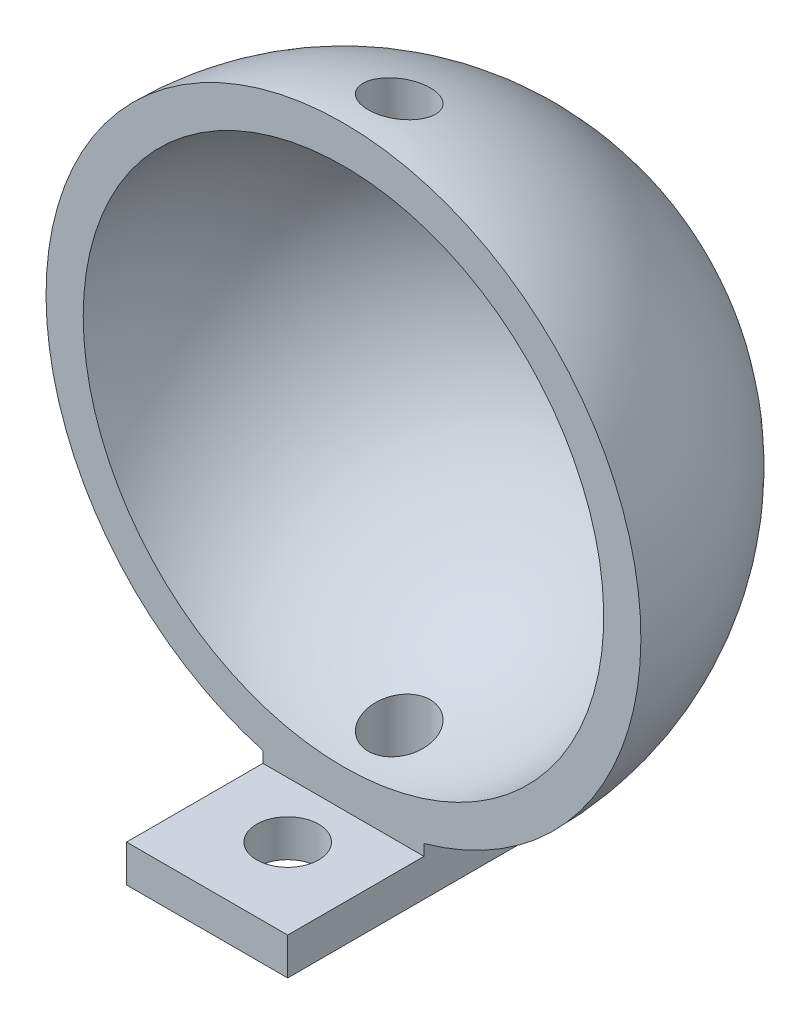
ISO-10303-21;
HEADER;
FILE_DESCRIPTION(('STEP AP214'),'2;1');
FILE_NAME('part.step','',(''),(''),'','','');
FILE_SCHEMA(('AUTOMOTIVE_DESIGN { 1 0 10303 214 1 1 1 1 }'));
ENDSEC;
DATA;
#1=APPLICATION_CONTEXT('core data for automotive mechanical design processes');
#2=APPLICATION_PROTOCOL_DEFINITION('international standard','automotive_design',2000,#1);
#3=PRODUCT_CONTEXT('',#1,'mechanical');
#4=PRODUCT('Part','Part','',(#3));
#5=PRODUCT_RELATED_PRODUCT_CATEGORY('part','',(#4));
#6=PRODUCT_DEFINITION_FORMATION('','',#4);
#7=PRODUCT_DEFINITION_CONTEXT('part definition',#1,'design');
#8=PRODUCT_DEFINITION('design','',#6,#7);
#9=PRODUCT_DEFINITION_SHAPE('','',#8);
#10=(LENGTH_UNIT() NAMED_UNIT(*) SI_UNIT(.MILLI.,.METRE.));
#11=(NAMED_UNIT(*) PLANE_ANGLE_UNIT() SI_UNIT($,.RADIAN.));
#12=(NAMED_UNIT(*) SI_UNIT($,.STERADIAN.) SOLID_ANGLE_UNIT());
#13=UNCERTAINTY_MEASURE_WITH_UNIT(LENGTH_MEASURE(1.E-05),#10,'distance_accuracy_value','');
#14=(GEOMETRIC_REPRESENTATION_CONTEXT(3) GLOBAL_UNCERTAINTY_ASSIGNED_CONTEXT((#13)) GLOBAL_UNIT_ASSIGNED_CONTEXT((#10,
#11,#12)) REPRESENTATION_CONTEXT('',''));
#15=CARTESIAN_POINT('',(0.,0.,0.));
#16=DIRECTION('',(0.,0.,1.));
#17=DIRECTION('',(1.,0.,0.));
#18=AXIS2_PLACEMENT_3D('',#15,#16,#17);
#19=CARTESIAN_POINT('',(-1.99999999999943,73.7499999999998,-8.45125390389471));
#20=DIRECTION('',(0.,0.,-1.));
#21=DIRECTION('',(0.,-1.,0.));
#22=AXIS2_PLACEMENT_3D('',#19,#20,#21);
#23=SPHERICAL_SURFACE('',#22,10.5);
#24=CARTESIAN_POINT('',(-2.98267470453717,83.7574210321402,-11.4738148562225));
#25=CARTESIAN_POINT('',(-3.02698657179367,83.7700945774445,-11.4174460274732));
#26=CARTESIAN_POINT('',(-3.06638557583696,83.7835883483438,-11.3573213167849));
#27=CARTESIAN_POINT('',(-3.1342801377072,83.8117892300735,-11.2313864950616));
#28=CARTESIAN_POINT('',(-3.1627593403856,83.8264981211162,-11.1655680354995));
#29=CARTESIAN_POINT('',(-3.20802566503183,83.8566630799685,-11.030273542497));
#30=CARTESIAN_POINT('',(-3.22482638154331,83.8721182565524,-10.9608018633688));
#31=CARTESIAN_POINT('',(-3.24636999295912,83.9033441842213,-10.8201084791735));
#32=CARTESIAN_POINT('',(-3.25111627564561,83.9191148453863,-10.7488872714771));
#33=CARTESIAN_POINT('',(-3.24842875620823,83.9506982554588,-10.6059221209248));
#34=CARTESIAN_POINT('',(-3.24087094661595,83.9665098092999,-10.5341802014763));
#35=CARTESIAN_POINT('',(-3.21351328844959,83.9975692681323,-10.3929351088143));
#36=CARTESIAN_POINT('',(-3.19371257669824,84.0128171333008,-10.3234320938166));
#37=CARTESIAN_POINT('',(-3.14239297532884,84.0422937299509,-10.1887887583457));
#38=CARTESIAN_POINT('',(-3.11089240210195,84.0565240131714,-10.1236418054889));
#39=CARTESIAN_POINT('',(-3.03697308394031,84.0835808781611,-9.99954045575665));
#40=CARTESIAN_POINT('',(-2.99455514593942,84.0964075635744,-9.94058560165868));
#41=CARTESIAN_POINT('',(-2.90068014223868,84.1200899607425,-9.83155891166125));
#42=CARTESIAN_POINT('',(-2.84937437549965,84.1309732929906,-9.78136287121975));
#43=CARTESIAN_POINT('',(-2.73869438226097,84.1506848258217,-9.69033225246326));
#44=CARTESIAN_POINT('',(-2.67932120326099,84.1595132928121,-9.64949646062903));
#45=CARTESIAN_POINT('',(-2.55562442451351,84.1746695849806,-9.57932510643226));
#46=CARTESIAN_POINT('',(-2.49144207583123,84.1810491524453,-9.54975170432153));
#47=CARTESIAN_POINT('',(-2.35884162587121,84.1913883913049,-9.50179510272381));
#48=CARTESIAN_POINT('',(-2.29042403947887,84.1953483562214,-9.48341054592096));
#49=CARTESIAN_POINT('',(-2.15272368626034,84.2006727567393,-9.45868633378811));
#50=CARTESIAN_POINT('',(-2.0834834449059,84.2020860492207,-9.45211995449979));
#51=CARTESIAN_POINT('',(-1.94486808160945,84.2024243039995,-9.45054862024959));
#52=CARTESIAN_POINT('',(-1.87549296878516,84.201349429034,-9.4555429091693));
#53=CARTESIAN_POINT('',(-1.73917096870216,84.1967634767917,-9.47684011834349));
#54=CARTESIAN_POINT('',(-1.67220885323761,84.1932724135717,-9.49305013482913));
#55=CARTESIAN_POINT('',(-1.54199380448686,84.1839793800973,-9.5361640676761));
#56=CARTESIAN_POINT('',(-1.47874091633887,84.1781773817274,-9.56306811414388));
#57=CARTESIAN_POINT('',(-1.35729953381102,84.1643892934392,-9.62693018146829));
#58=CARTESIAN_POINT('',(-1.29914422775733,84.156390117502,-9.66394843360688));
#59=CARTESIAN_POINT('',(-1.18987537094369,84.1384519512581,-9.74684196775394));
#60=CARTESIAN_POINT('',(-1.13876236560717,84.1285128108459,-9.79271793512896));
#61=CARTESIAN_POINT('',(-1.04404450132552,84.1067776448228,-9.89287095555435));
#62=CARTESIAN_POINT('',(-1.00058858847941,84.094951859924,-9.94728236349669));
#63=CARTESIAN_POINT('',(-0.923400586642896,84.0699006180318,-10.0623223409357));
#64=CARTESIAN_POINT('',(-0.889669594136821,84.0566750034373,-10.1229516104521));
#65=CARTESIAN_POINT('',(-0.832102201822862,84.0288699803854,-10.2501492863576));
#66=CARTESIAN_POINT('',(-0.808503081280336,84.0142669689596,-10.3168199442235));
#67=CARTESIAN_POINT('',(-0.772871347105705,83.9843642230932,-10.453034447679));
#68=CARTESIAN_POINT('',(-0.760839972849812,83.969064414181,-10.5225786003044));
#69=CARTESIAN_POINT('',(-0.748511499916005,83.9379030795133,-10.6638934054602));
#70=CARTESIAN_POINT('',(-0.748428082320024,83.9220364014929,-10.7356816343785));
#71=CARTESIAN_POINT('',(-0.760528240189796,83.8904512986131,-10.8782532220807));
#72=CARTESIAN_POINT('',(-0.772712517693984,83.8747328822901,-10.9490365231208));
#73=CARTESIAN_POINT('',(-0.80915121517212,83.8438058689032,-11.0879924818506));
#74=CARTESIAN_POINT('',(-0.833473030827275,83.828600630392,-11.1561482473993));
#75=CARTESIAN_POINT('',(-0.89360891765945,83.799248172902,-11.2874376223778));
#76=CARTESIAN_POINT('',(-0.929422627811282,83.785100920703,-11.350571389499));
#77=CARTESIAN_POINT('',(-1.01120000487411,83.7584412359706,-11.4693161766889));
#78=CARTESIAN_POINT('',(-1.05705905093194,83.7459139272386,-11.5249958456445));
#79=CARTESIAN_POINT('',(-1.15790195092541,83.7227384988544,-11.6278364393555));
#80=CARTESIAN_POINT('',(-1.21288475379046,83.7120901630329,-11.6749983440649));
#81=CARTESIAN_POINT('',(-1.32914194621312,83.6932465204074,-11.7583507467388));
#82=CARTESIAN_POINT('',(-1.39025298463614,83.6850027833201,-11.7947580743389));
#83=CARTESIAN_POINT('',(-1.51799051046677,83.6709501397213,-11.8567645699069));
#84=CARTESIAN_POINT('',(-1.58461620189052,83.6651408825489,-11.882365294455));
#85=CARTESIAN_POINT('',(-1.71979500116962,83.6562731676182,-11.9214252973123));
#86=CARTESIAN_POINT('',(-1.78826535307279,83.6531529479053,-11.9351572022114));
#87=CARTESIAN_POINT('',(-1.9265996857432,83.6495444077477,-11.951036989628));
#88=CARTESIAN_POINT('',(-1.99646346816201,83.6490557153631,-11.9531865091985));
#89=CARTESIAN_POINT('',(-2.1345483474461,83.6507148617552,-11.9458863092498));
#90=CARTESIAN_POINT('',(-2.20277867591026,83.6528253052409,-11.936601107855));
#91=CARTESIAN_POINT('',(-2.33669383435235,83.6595470825424,-11.9070067410159));
#92=CARTESIAN_POINT('',(-2.40237803609639,83.664159029426,-11.8866948731589));
#93=CARTESIAN_POINT('',(-2.52951196825556,83.6757398745254,-11.8356364324424));
#94=CARTESIAN_POINT('',(-2.59095081137947,83.6827145803086,-11.8048641476448));
#95=CARTESIAN_POINT('',(-2.70771888676437,83.6987837411616,-11.7338686087751));
#96=CARTESIAN_POINT('',(-2.76305506879261,83.7078757475179,-11.6936562719393));
#97=CARTESIAN_POINT('',(-2.84547708695338,83.7238599945206,-11.6228433673364));
#98=CARTESIAN_POINT('',(-2.87498072893177,83.7301684058679,-11.5948721435998));
#99=CARTESIAN_POINT('',(-2.93106985981217,83.7433710651268,-11.5362713316723));
#100=CARTESIAN_POINT('',(-2.957655379521,83.7502653068524,-11.5056417715519));
#101=CARTESIAN_POINT('',(-2.98267470453717,83.7574210321402,-11.4738148562225));
#102=B_SPLINE_CURVE_WITH_KNOTS('',3,(#24,#25,#26,#27,#28,#29,#30,#31,#32,#33,#34,#35,#36,#37,
#38,#39,#40,#41,#42,#43,#44,#45,#46,#47,#48,#49,#50,#51,#52,#53,#54,#55,#56,#57,#58,#59,#60,#61,
#62,#63,#64,#65,#66,#67,#68,#69,#70,#71,#72,#73,#74,#75,#76,#77,#78,#79,#80,#81,#82,#83,#84,#85,
#86,#87,#88,#89,#90,#91,#92,#93,#94,#95,#96,#97,#98,#99,#100,#101),.UNSPECIFIED.,.T.,.F.,(4,2,2,
2,2,2,2,2,2,2,2,2,2,2,2,2,2,2,2,2,2,2,2,2,2,2,2,2,2,2,2,2,2,2,2,2,2,2,4),(0.,0.218283120509509,
0.436891909573116,0.655245795211382,0.873538307805994,1.09404454470742,1.31456633002018,
1.53474432885956,1.75490605838027,1.97163399282794,2.18833381344285,2.40016332138132,
2.61196712721343,2.81966246104674,3.02734421107779,3.23332593952154,3.43931017407156,
3.64654886103659,3.85380358954504,4.06472758787278,4.27567535857958,4.49132459524758,
4.7069969341478,4.92652595316081,5.14606753578644,5.36684195441271,5.58760943794889,
5.80617859543711,6.02472259088614,6.23850070454982,6.45224801515511,6.66094410395764,
6.86961069490486,7.07530983722569,7.28105941501707,7.48731843138981,7.69334007821544,
7.81658819067719,7.93983500187466),.UNSPECIFIED.);
#103=CARTESIAN_POINT('',(-2.98267470453717,83.7574210321402,-11.4738148562225));
#104=VERTEX_POINT('',#103);
#105=EDGE_CURVE('E225',#104,#104,#102,.T.);
#106=ORIENTED_EDGE('',*,*,#105,.T.);
#107=EDGE_LOOP('',(#106));
#108=FACE_BOUND('',#107,.T.);
#109=CARTESIAN_POINT('',(-1.99999999999943,73.7499999999998,-8.45125390389471));
#110=DIRECTION('',(0.,0.,-1.));
#111=DIRECTION('',(-1.,0.,0.));
#112=AXIS2_PLACEMENT_3D('',#109,#110,#111);
#113=CIRCLE('',#112,10.5);
#114=CARTESIAN_POINT('',(-12.4999999999994,73.7499999999998,-8.45125390389471));
#115=VERTEX_POINT('',#114);
#116=EDGE_CURVE('E159',#115,#115,#113,.T.);
#117=ORIENTED_EDGE('',*,*,#116,.F.);
#118=EDGE_LOOP('',(#117));
#119=FACE_BOUND('',#118,.T.);
#120=CARTESIAN_POINT('',(-3.05430325494646,63.7198882633143,-11.3727780260289));
#121=CARTESIAN_POINT('',(-3.01684484619078,63.7330797565567,-11.4315833378468));
#122=CARTESIAN_POINT('',(-2.97436616882103,63.745624750699,-11.4873899455408));
#123=CARTESIAN_POINT('',(-2.8804295307973,63.769031422925,-11.5913436597279));
#124=CARTESIAN_POINT('',(-2.82896297693108,63.7798914711135,-11.6394833509767));
#125=CARTESIAN_POINT('',(-2.71839078021957,63.7995747617412,-11.7266171715136));
#126=CARTESIAN_POINT('',(-2.6592808318253,63.8083968483256,-11.7656061110399));
#127=CARTESIAN_POINT('',(-2.53510330748006,63.8236921296812,-11.8331363218189));
#128=CARTESIAN_POINT('',(-2.47003737293377,63.8301659691776,-11.8616804607723));
#129=CARTESIAN_POINT('',(-2.33698692879885,63.8404477626396,-11.9069873724398));
#130=CARTESIAN_POINT('',(-2.26907220606933,63.8442998147158,-11.9239450478352));
#131=CARTESIAN_POINT('',(-2.1312701735493,63.8493787985908,-11.94629977577));
#132=CARTESIAN_POINT('',(-2.06138300364245,63.8506059160753,-11.9516976460405));
#133=CARTESIAN_POINT('',(-1.92280974747775,63.8503929073468,-11.9507604297152));
#134=CARTESIAN_POINT('',(-1.85412226013539,63.8489949519223,-11.9446108485207));
#135=CARTESIAN_POINT('',(-1.71878687441237,63.8436639062833,-11.9211455039061));
#136=CARTESIAN_POINT('',(-1.65213892056095,63.8397308850812,-11.9038300444562));
#137=CARTESIAN_POINT('',(-1.52277073006787,63.829466980144,-11.858598506842));
#138=CARTESIAN_POINT('',(-1.46004913670938,63.8231369300688,-11.8306861141644));
#139=CARTESIAN_POINT('',(-1.34020360000769,63.8082895270837,-11.7651311803049));
#140=CARTESIAN_POINT('',(-1.28307999074441,63.7997720437405,-11.7274880588937));
#141=CARTESIAN_POINT('',(-1.17510302134719,63.7806770338197,-11.6429632000292));
#142=CARTESIAN_POINT('',(-1.12435736676093,63.7700703426533,-11.5959505424497));
#143=CARTESIAN_POINT('',(-1.03145057501733,63.7472112405068,-11.4944422296517));
#144=CARTESIAN_POINT('',(-0.989290420606247,63.7349586413925,-11.439945718982));
#145=CARTESIAN_POINT('',(-0.913701608054735,63.7088650161442,-11.3236499330389));
#146=CARTESIAN_POINT('',(-0.880500746133213,63.6949934925149,-11.2617094383686));
#147=CARTESIAN_POINT('',(-0.824969413883097,63.6663086133607,-11.1333369398532));
#148=CARTESIAN_POINT('',(-0.802640243593217,63.6514951454372,-11.0669043999299));
#149=CARTESIAN_POINT('',(-0.769025632565222,63.6210167081612,-10.9299060060038));
#150=CARTESIAN_POINT('',(-0.757986760010414,63.6053403005361,-10.8592821218266));
#151=CARTESIAN_POINT('',(-0.748074508943659,63.5738780861142,-10.7172073112265));
#152=CARTESIAN_POINT('',(-0.749202066074187,63.558092270997,-10.6457563216184));
#153=CARTESIAN_POINT('',(-0.763679479948762,63.5266892394736,-10.503290825093));
#154=CARTESIAN_POINT('',(-0.777153452775553,63.5110753676936,-10.4322881367576));
#155=CARTESIAN_POINT('',(-0.816177546402058,63.4806228372933,-10.2935038366596));
#156=CARTESIAN_POINT('',(-0.841727618992515,63.4657841755787,-10.2257222120393));
#157=CARTESIAN_POINT('',(-0.90409850442654,63.4373816068027,-10.0957211752072));
#158=CARTESIAN_POINT('',(-0.940859168776075,63.423811389818,-10.0334743149467));
#159=CARTESIAN_POINT('',(-1.02474071559583,63.3982529730535,-9.91603102560873));
#160=CARTESIAN_POINT('',(-1.07186067815073,63.3862646329528,-9.86083397118964));
#161=CARTESIAN_POINT('',(-1.17423368251902,63.364429641154,-9.76015293901143));
#162=CARTESIAN_POINT('',(-1.22932426442942,63.3545481846526,-9.71451138339848));
#163=CARTESIAN_POINT('',(-1.34671709446769,63.3369558613575,-9.63316266251759));
#164=CARTESIAN_POINT('',(-1.40901838605283,63.3292447071252,-9.59745418170333));
#165=CARTESIAN_POINT('',(-1.53754486472989,63.3163803472595,-9.53783647500419));
#166=CARTESIAN_POINT('',(-1.60364921182792,63.3111731594979,-9.51367831253818));
#167=CARTESIAN_POINT('',(-1.73910991577679,63.3032207477256,-9.47676928953718));
#168=CARTESIAN_POINT('',(-1.80846590716864,63.3004752477355,-9.46401715027496));
#169=CARTESIAN_POINT('',(-1.94717355358766,63.2975568321263,-9.45046144260764));
#170=CARTESIAN_POINT('',(-2.01650454023857,63.2973402471461,-9.44945504854738));
#171=CARTESIAN_POINT('',(-2.15434278186234,63.2993729617758,-9.45889735258011));
#172=CARTESIAN_POINT('',(-2.22285007605253,63.3016221435127,-9.4693455031029));
#173=CARTESIAN_POINT('',(-2.35676220666762,63.3085014244619,-9.50128037761376));
#174=CARTESIAN_POINT('',(-2.42218040123642,63.313119999445,-9.52271367170553));
#175=CARTESIAN_POINT('',(-2.54845620992181,63.3245952990401,-9.57591380735342));
#176=CARTESIAN_POINT('',(-2.60931368208052,63.3314520932837,-9.60768097039921));
#177=CARTESIAN_POINT('',(-2.72537472120222,63.347280593966,-9.68091878096241));
#178=CARTESIAN_POINT('',(-2.78052035313707,63.3562714024411,-9.72247704438048));
#179=CARTESIAN_POINT('',(-2.88306215314734,63.3760783799089,-9.81388681263366));
#180=CARTESIAN_POINT('',(-2.93045761052659,63.3868947161191,-9.86373907718948));
#181=CARTESIAN_POINT('',(-3.01715606180152,63.4102848889208,-9.9713495900368));
#182=CARTESIAN_POINT('',(-3.05628242057958,63.4228889925703,-10.0292435339155));
#183=CARTESIAN_POINT('',(-3.12428157363297,63.4493424650268,-10.1505048260045));
#184=CARTESIAN_POINT('',(-3.15315357766707,63.4631919297033,-10.2138725955819));
#185=CARTESIAN_POINT('',(-3.20047869792738,63.4920821356551,-10.3457725853883));
#186=CARTESIAN_POINT('',(-3.21868907494759,63.5071423594319,-10.414387661873));
#187=CARTESIAN_POINT('',(-3.2432628857414,63.5377721174474,-10.5536175061435));
#188=CARTESIAN_POINT('',(-3.24962232313265,63.5533418216929,-10.6242329403446));
#189=CARTESIAN_POINT('',(-3.25035084806411,63.5848126994935,-10.766635840774));
#190=CARTESIAN_POINT('',(-3.24452638837633,63.600715189706,-10.8384239753947));
#191=CARTESIAN_POINT('',(-3.22064002089885,63.6321415196317,-10.979961929854));
#192=CARTESIAN_POINT('',(-3.20259173829125,63.6476657610186,-11.0497139290533));
#193=CARTESIAN_POINT('',(-3.16291390184054,63.6727338900925,-11.1621000494177));
#194=CARTESIAN_POINT('',(-3.14459705972518,63.6825139820295,-11.2058797594028));
#195=CARTESIAN_POINT('',(-3.10306640213017,63.7015923915591,-11.2911640058764));
#196=CARTESIAN_POINT('',(-3.07985259998865,63.710890710464,-11.3326685485616));
#197=CARTESIAN_POINT('',(-3.05430325494646,63.7198882633143,-11.3727780260289));
#198=B_SPLINE_CURVE_WITH_KNOTS('',3,(#120,#121,#122,#123,#124,#125,#126,#127,#128,#129,#130,
#131,#132,#133,#134,#135,#136,#137,#138,#139,#140,#141,#142,#143,#144,#145,#146,#147,#148,#149,
#150,#151,#152,#153,#154,#155,#156,#157,#158,#159,#160,#161,#162,#163,#164,#165,#166,#167,#168,
#169,#170,#171,#172,#173,#174,#175,#176,#177,#178,#179,#180,#181,#182,#183,#184,#185,#186,#187,
#188,#189,#190,#191,#192,#193,#194,#195,#196,#197),.UNSPECIFIED.,.T.,.F.,(4,2,2,2,2,2,2,2,2,2,2,
2,2,2,2,2,2,2,2,2,2,2,2,2,2,2,2,2,2,2,2,2,2,2,2,2,2,2,4),(0.,0.212706546565718,0.42561758423084,
0.638649082141774,0.85162204664499,1.06091791777369,1.27019898299572,1.47614675861033,
1.68208892792009,1.8879595385209,2.09384242772172,2.30283414936532,2.51184977998624,
2.72576406825536,2.93970393015238,3.15822222105623,3.37675731692727,3.59751369512122,
3.81826919203631,4.03786050226433,4.2574323204502,4.47303403563438,4.68860718270295,
4.89929754058955,5.10996427505584,5.31698772049647,5.52400126987156,5.73001736264009,
5.9360398652421,6.14398111370934,6.35194141984672,6.56397388942988,6.77602269553193,
6.99272840455497,7.20950717801756,7.4297557205472,7.64975916803069,7.7948408181486,
7.93992207310491),.UNSPECIFIED.);
#199=CARTESIAN_POINT('',(-3.05430325494646,63.7198882633143,-11.3727780260289));
#200=VERTEX_POINT('',#199);
#201=EDGE_CURVE('E154',#200,#200,#198,.T.);
#202=ORIENTED_EDGE('',*,*,#201,.T.);
#203=EDGE_LOOP('',(#202));
#204=FACE_BOUND('',#203,.T.);
#205=ADVANCED_FACE('F77',(#108,#119,#204),#23,.F.);
#206=CARTESIAN_POINT('',(-1.99999999999943,73.7499999999998,-8.45125390389471));
#207=DIRECTION('',(0.,0.,-1.));
#208=DIRECTION('',(0.,1.,0.));
#209=AXIS2_PLACEMENT_3D('',#206,#207,#208);
#210=SPHERICAL_SURFACE('',#209,12.);
#211=CARTESIAN_POINT('',(-5.24999999999943,73.7499999999998,-8.45125390389471));
#212=DIRECTION('',(1.,0.,0.));
#213=DIRECTION('',(0.,0.,-1.));
#214=AXIS2_PLACEMENT_3D('',#211,#212,#213);
#215=CIRCLE('',#214,11.5515150521479);
#216=CARTESIAN_POINT('',(-5.24999999999943,62.1984849478519,-8.45125390389471));
#217=VERTEX_POINT('',#216);
#218=CARTESIAN_POINT('',(-5.24999999999943,63.5918751730448,-13.9512539038947));
#219=VERTEX_POINT('',#218);
#220=EDGE_CURVE('E97',#217,#219,#215,.T.);
#221=ORIENTED_EDGE('',*,*,#220,.F.);
#222=CARTESIAN_POINT('',(-1.99999999999943,73.7499999999998,-8.45125390389471));
#223=DIRECTION('',(0.,0.,-1.));
#224=DIRECTION('',(-1.,0.,0.));
#225=AXIS2_PLACEMENT_3D('',#222,#223,#224);
#226=CIRCLE('',#225,12.);
#227=CARTESIAN_POINT('',(1.25000000000057,62.1984849478519,-8.45125390389471));
#228=VERTEX_POINT('',#227);
#229=EDGE_CURVE('E152',#217,#228,#226,.T.);
#230=ORIENTED_EDGE('',*,*,#229,.T.);
#231=CARTESIAN_POINT('',(1.25000000000057,73.7499999999998,-8.45125390389471));
#232=DIRECTION('',(1.,0.,0.));
#233=DIRECTION('',(0.,0.,-1.));
#234=AXIS2_PLACEMENT_3D('',#231,#232,#233);
#235=CIRCLE('',#234,11.5515150521479);
#236=CARTESIAN_POINT('',(1.25000000000057,63.5918751730448,-13.9512539038947));
#237=VERTEX_POINT('',#236);
#238=EDGE_CURVE('E105',#228,#237,#235,.T.);
#239=ORIENTED_EDGE('',*,*,#238,.T.);
#240=CARTESIAN_POINT('',(-1.99999999999943,73.7499999999998,-13.9512539038947));
#241=DIRECTION('',(0.,0.,-1.));
#242=DIRECTION('',(-1.,0.,0.));
#243=AXIS2_PLACEMENT_3D('',#240,#241,#242);
#244=CIRCLE('',#243,10.6653645038508);
#245=EDGE_CURVE('E145',#237,#219,#244,.T.);
#246=ORIENTED_EDGE('',*,*,#245,.T.);
#247=EDGE_LOOP('',(#221,#230,#239,#246));
#248=FACE_BOUND('',#247,.T.);
#249=CARTESIAN_POINT('',(-3.04396271721659,85.3379807189947,-11.3887434274953));
#250=CARTESIAN_POINT('',(-3.00557607560629,85.3266635823805,-11.4470290372428));
#251=CARTESIAN_POINT('',(-2.96221981667208,85.3159323039836,-11.5022114704088));
#252=CARTESIAN_POINT('',(-2.8666896604265,85.2959717189144,-11.6047288346357));
#253=CARTESIAN_POINT('',(-2.81450687302031,85.2867439451561,-11.6520557574372));
#254=CARTESIAN_POINT('',(-2.70272883938089,85.2700856780144,-11.7374084645939));
#255=CARTESIAN_POINT('',(-2.64313134957595,85.2626557306374,-11.7754314233411));
#256=CARTESIAN_POINT('',(-2.51822194146638,85.2498428830237,-11.8409550021123));
#257=CARTESIAN_POINT('',(-2.45291153301414,85.2444594439194,-11.868458392064));
#258=CARTESIAN_POINT('',(-2.31931370261722,85.2359735224982,-11.9117939352383));
#259=CARTESIAN_POINT('',(-2.25107505765679,85.2328427394405,-11.9277709051361));
#260=CARTESIAN_POINT('',(-2.11282261208313,85.228856562812,-11.9481108100948));
#261=CARTESIAN_POINT('',(-2.04280888351258,85.2280010770459,-11.9524742157386));
#262=CARTESIAN_POINT('',(-1.90384781851058,85.228591034455,-11.9494645506159));
#263=CARTESIAN_POINT('',(-1.83489743594464,85.2300103077734,-11.9422249659245));
#264=CARTESIAN_POINT('',(-1.69921658141955,85.2350531958893,-11.9164893175481));
#265=CARTESIAN_POINT('',(-1.63248606885931,85.238676770347,-11.8979934598582));
#266=CARTESIAN_POINT('',(-1.5030944835611,85.2480106237494,-11.8503146419285));
#267=CARTESIAN_POINT('',(-1.440434710514,85.2537215653222,-11.8211282880177));
#268=CARTESIAN_POINT('',(-1.32091889931888,85.2670470901887,-11.7529584661146));
#269=CARTESIAN_POINT('',(-1.2640631341883,85.2746617629747,-11.7139745375479));
#270=CARTESIAN_POINT('',(-1.157035625044,85.2916589225362,-11.6268499411191));
#271=CARTESIAN_POINT('',(-1.10695014825677,85.3010611061131,-11.5786071867712));
#272=CARTESIAN_POINT('',(-1.01556631552133,85.3212880803447,-11.4746748549566));
#273=CARTESIAN_POINT('',(-0.97426874046931,85.3321129972858,-11.4189846164192));
#274=CARTESIAN_POINT('',(-0.900855452609388,85.3550727126586,-11.3006808453585));
#275=CARTESIAN_POINT('',(-0.868915586622747,85.3672273385672,-11.2379620365054));
#276=CARTESIAN_POINT('',(-0.816021592369282,85.3923321581442,-11.1082004406439));
#277=CARTESIAN_POINT('',(-0.795068461480304,85.4052824239219,-11.0411572616886));
#278=CARTESIAN_POINT('',(-0.764425224414842,85.4318258107705,-10.90350379968));
#279=CARTESIAN_POINT('',(-0.754919688231899,85.4454258829746,-10.8328537259289));
#280=CARTESIAN_POINT('',(-0.748025799337393,85.4726891534468,-10.6909749870122));
#281=CARTESIAN_POINT('',(-0.750638127132518,85.4863523552171,-10.6197462895769));
#282=CARTESIAN_POINT('',(-0.767983709867031,85.5134588528496,-10.4781918732295));
#283=CARTESIAN_POINT('',(-0.782804417554423,85.5268998461315,-10.4078763989848));
#284=CARTESIAN_POINT('',(-0.824306528098467,85.5530792794304,-10.2706963470794));
#285=CARTESIAN_POINT('',(-0.850987858286566,85.5658177237511,-10.2038317482785));
#286=CARTESIAN_POINT('',(-0.915372486151267,85.5901730176668,-10.0757985087667));
#287=CARTESIAN_POINT('',(-0.953025804898513,85.6017946421559,-10.0146056627413));
#288=CARTESIAN_POINT('',(-1.038395308746,85.6236439277501,-9.8994093310112));
#289=CARTESIAN_POINT('',(-1.08611080206856,85.6338716846045,-9.84540535148585));
#290=CARTESIAN_POINT('',(-1.18954839932509,85.652497666602,-9.74695057839136));
#291=CARTESIAN_POINT('',(-1.24514861446546,85.6609195738461,-9.7023762430621));
#292=CARTESIAN_POINT('',(-1.36328778463968,85.6758625174814,-9.62322262475172));
#293=CARTESIAN_POINT('',(-1.42582604595155,85.682383743682,-9.58864234372842));
#294=CARTESIAN_POINT('',(-1.55490359451605,85.6932320528021,-9.53108439099351));
#295=CARTESIAN_POINT('',(-1.62135511836901,85.697595087904,-9.50791663314374));
#296=CARTESIAN_POINT('',(-1.75730086229899,85.7041621815925,-9.47303555690196));
#297=CARTESIAN_POINT('',(-1.82679482745003,85.7063664207042,-9.4613212807352));
#298=CARTESIAN_POINT('',(-1.96588864765044,85.708534869953,-9.44979722239606));
#299=CARTESIAN_POINT('',(-2.03547550054765,85.7085276919549,-9.44983538425384));
#300=CARTESIAN_POINT('',(-2.17364555356819,85.7063451891919,-9.46143409998031));
#301=CARTESIAN_POINT('',(-2.2422287883768,85.7041699395364,-9.47299425468743));
#302=CARTESIAN_POINT('',(-2.37622465912064,85.6977266232525,-9.507218075606));
#303=CARTESIAN_POINT('',(-2.4416467708646,85.6934653007422,-9.52984596047014));
#304=CARTESIAN_POINT('',(-2.56773873932914,85.6829774569205,-9.58549309713183));
#305=CARTESIAN_POINT('',(-2.62840846651941,85.6767508820677,-9.6185126320397));
#306=CARTESIAN_POINT('',(-2.74379254043863,85.6624557049193,-9.69424287609943));
#307=CARTESIAN_POINT('',(-2.79845768695925,85.6543733524194,-9.73702591177007));
#308=CARTESIAN_POINT('',(-2.89984018716251,85.6366221427638,-9.8308744909046));
#309=CARTESIAN_POINT('',(-2.9465569525569,85.6269531682804,-9.88194064688607));
#310=CARTESIAN_POINT('',(-3.03148962957001,85.6061356388692,-9.99173334876267));
#311=CARTESIAN_POINT('',(-3.06956411884383,85.5949666593343,-10.0505654043635));
#312=CARTESIAN_POINT('',(-3.13531068455079,85.571575551049,-10.1735846048524));
#313=CARTESIAN_POINT('',(-3.1629822240087,85.5593533679746,-10.2377720259627));
#314=CARTESIAN_POINT('',(-3.20761053408661,85.5339757730475,-10.3708269020394));
#315=CARTESIAN_POINT('',(-3.22438108761099,85.5208082046434,-10.4397545170492));
#316=CARTESIAN_POINT('',(-3.24605183716919,85.494084869215,-10.5793981491087));
#317=CARTESIAN_POINT('',(-3.25094830404571,85.4805289815879,-10.6501147209516));
#318=CARTESIAN_POINT('',(-3.24873520768081,85.4532481561043,-10.7921807631745));
#319=CARTESIAN_POINT('',(-3.24148477436599,85.4395230927227,-10.8635279808677));
#320=CARTESIAN_POINT('',(-3.21489511056427,85.4124631720705,-11.0039506638663));
#321=CARTESIAN_POINT('',(-3.19556968203393,85.3991278874668,-11.0730286282162));
#322=CARTESIAN_POINT('',(-3.15414314989747,85.3777539731131,-11.1835670354682));
#323=CARTESIAN_POINT('',(-3.13536040475332,85.3694900244167,-11.2262575553694));
#324=CARTESIAN_POINT('',(-3.09311454335501,85.3533901664848,-11.3093431019473));
#325=CARTESIAN_POINT('',(-3.06965143111375,85.3455542568825,-11.3497381305921));
#326=CARTESIAN_POINT('',(-3.04396271721659,85.3379807189947,-11.3887434274953));
#327=B_SPLINE_CURVE_WITH_KNOTS('',3,(#249,#250,#251,#252,#253,#254,#255,#256,#257,#258,#259,
#260,#261,#262,#263,#264,#265,#266,#267,#268,#269,#270,#271,#272,#273,#274,#275,#276,#277,#278,
#279,#280,#281,#282,#283,#284,#285,#286,#287,#288,#289,#290,#291,#292,#293,#294,#295,#296,#297,
#298,#299,#300,#301,#302,#303,#304,#305,#306,#307,#308,#309,#310,#311,#312,#313,#314,#315,#316,
#317,#318,#319,#320,#321,#322,#323,#324,#325,#326),.UNSPECIFIED.,.T.,.F.,(4,2,2,2,2,2,2,2,2,2,2,
2,2,2,2,2,2,2,2,2,2,2,2,2,2,2,2,2,2,2,2,2,2,2,2,2,2,2,4),(0.,0.211938457903934,
0.424091665740961,0.636309224627079,0.848470865572065,1.0579181723018,1.26735699207139,
1.47440357823321,1.68144637546011,1.88855495494169,2.09567327221568,2.30522213891814,
2.51478961844147,2.72807411496258,2.94137797013908,3.15807676705871,3.37478773334795,
3.59306471282722,3.81134035496911,4.02863686214421,4.24591843498339,4.46014774202053,
4.67435564795132,4.88486371524759,5.0953541777173,5.30312137807108,5.51088138090256,
5.7179741031599,5.92507246794379,6.1337578728044,6.3424587165093,6.55436157872108,
6.76627537734711,6.98172018170111,7.19723263955976,7.41526177890439,7.63304216141384,
7.77487356026737,7.91670483751663),.UNSPECIFIED.);
#328=CARTESIAN_POINT('',(-3.04396271721659,85.3379807189947,-11.3887434274953));
#329=VERTEX_POINT('',#328);
#330=EDGE_CURVE('E81',#329,#329,#327,.T.);
#331=ORIENTED_EDGE('',*,*,#330,.T.);
#332=EDGE_LOOP('',(#331));
#333=FACE_BOUND('',#332,.T.);
#334=ADVANCED_FACE('F149',(#248,#333),#210,.T.);
#335=CARTESIAN_POINT('',(0.,61.7499999999998,0.));
#336=DIRECTION('',(0.,-1.,0.));
#337=DIRECTION('',(0.,0.,-1.));
#338=AXIS2_PLACEMENT_3D('',#335,#336,#337);
#339=PLANE('',#338);
#340=CARTESIAN_POINT('',(-1.99999999999943,61.7499999999998,-6.20125390389471));
#341=DIRECTION('',(0.,1.,0.));
#342=DIRECTION('',(0.,0.,1.));
#343=AXIS2_PLACEMENT_3D('',#340,#341,#342);
#344=CIRCLE('',#343,1.25);
#345=CARTESIAN_POINT('',(-1.99999999999943,61.7499999999998,-4.95125390389471));
#346=VERTEX_POINT('',#345);
#347=EDGE_CURVE('E172',#346,#346,#344,.T.);
#348=ORIENTED_EDGE('',*,*,#347,.F.);
#349=EDGE_LOOP('',(#348));
#350=FACE_BOUND('',#349,.T.);
#351=DIRECTION('',(1.,0.,0.));
#352=VECTOR('',#351,1.);
#353=CARTESIAN_POINT('',(0.,61.7499999999998,-8.45125390389471));
#354=LINE('',#353,#352);
#355=CARTESIAN_POINT('',(-5.24999999999943,61.7499999999998,-8.45125390389471));
#356=VERTEX_POINT('',#355);
#357=CARTESIAN_POINT('',(1.25000000000057,61.7499999999998,-8.45125390389471));
#358=VERTEX_POINT('',#357);
#359=EDGE_CURVE('E166',#356,#358,#354,.T.);
#360=ORIENTED_EDGE('',*,*,#359,.F.);
#361=DIRECTION('',(0.,0.,1.));
#362=VECTOR('',#361,1.);
#363=CARTESIAN_POINT('',(-5.24999999999943,61.7499999999998,-13.9512539038947));
#364=LINE('',#363,#362);
#365=CARTESIAN_POINT('',(-5.24999999999943,61.7499999999998,-2.95125390389471));
#366=VERTEX_POINT('',#365);
#367=EDGE_CURVE('E143',#356,#366,#364,.T.);
#368=ORIENTED_EDGE('',*,*,#367,.T.);
#369=DIRECTION('',(1.,0.,0.));
#370=VECTOR('',#369,1.);
#371=CARTESIAN_POINT('',(-5.24999999999943,61.7499999999998,-2.95125390389471));
#372=LINE('',#371,#370);
#373=CARTESIAN_POINT('',(1.25000000000057,61.7499999999998,-2.95125390389471));
#374=VERTEX_POINT('',#373);
#375=EDGE_CURVE('E180',#366,#374,#372,.T.);
#376=ORIENTED_EDGE('',*,*,#375,.T.);
#377=DIRECTION('',(0.,0.,1.));
#378=VECTOR('',#377,1.);
#379=CARTESIAN_POINT('',(1.25000000000057,61.7499999999998,-13.9512539038947));
#380=LINE('',#379,#378);
#381=EDGE_CURVE('E178',#358,#374,#380,.T.);
#382=ORIENTED_EDGE('',*,*,#381,.F.);
#383=EDGE_LOOP('',(#360,#368,#376,#382));
#384=FACE_BOUND('',#383,.T.);
#385=ADVANCED_FACE('F208',(#350,#384),#339,.F.);
#386=CARTESIAN_POINT('',(0.,60.2499999999998,0.));
#387=DIRECTION('',(0.,-1.,0.));
#388=DIRECTION('',(0.,0.,-1.));
#389=AXIS2_PLACEMENT_3D('',#386,#387,#388);
#390=PLANE('',#389);
#391=DIRECTION('',(0.,0.,1.));
#392=VECTOR('',#391,1.);
#393=CARTESIAN_POINT('',(1.25000000000057,60.2499999999998,-13.9512539038947));
#394=LINE('',#393,#392);
#395=CARTESIAN_POINT('',(1.25000000000057,60.2499999999998,-13.9512539038947));
#396=VERTEX_POINT('',#395);
#397=CARTESIAN_POINT('',(1.25000000000057,60.2499999999998,-2.95125390389471));
#398=VERTEX_POINT('',#397);
#399=EDGE_CURVE('E138',#396,#398,#394,.T.);
#400=ORIENTED_EDGE('',*,*,#399,.T.);
#401=DIRECTION('',(1.,0.,0.));
#402=VECTOR('',#401,1.);
#403=CARTESIAN_POINT('',(-5.24999999999943,60.2499999999998,-2.95125390389471));
#404=LINE('',#403,#402);
#405=CARTESIAN_POINT('',(-5.24999999999943,60.2499999999998,-2.95125390389471));
#406=VERTEX_POINT('',#405);
#407=EDGE_CURVE('E187',#406,#398,#404,.T.);
#408=ORIENTED_EDGE('',*,*,#407,.F.);
#409=DIRECTION('',(0.,0.,1.));
#410=VECTOR('',#409,1.);
#411=CARTESIAN_POINT('',(-5.24999999999943,60.2499999999998,-13.9512539038947));
#412=LINE('',#411,#410);
#413=CARTESIAN_POINT('',(-5.24999999999943,60.2499999999998,-13.9512539038947));
#414=VERTEX_POINT('',#413);
#415=EDGE_CURVE('E181',#414,#406,#412,.T.);
#416=ORIENTED_EDGE('',*,*,#415,.F.);
#417=DIRECTION('',(1.,0.,0.));
#418=VECTOR('',#417,1.);
#419=CARTESIAN_POINT('',(-5.24999999999943,60.2499999999998,-13.9512539038947));
#420=LINE('',#419,#418);
#421=EDGE_CURVE('E175',#414,#396,#420,.T.);
#422=ORIENTED_EDGE('',*,*,#421,.T.);
#423=EDGE_LOOP('',(#400,#408,#416,#422));
#424=FACE_BOUND('',#423,.T.);
#425=CARTESIAN_POINT('',(-1.99999999999943,60.2499999999998,-10.7012539038947));
#426=DIRECTION('',(0.,1.,0.));
#427=DIRECTION('',(0.,0.,1.));
#428=AXIS2_PLACEMENT_3D('',#425,#426,#427);
#429=CIRCLE('',#428,1.25);
#430=CARTESIAN_POINT('',(-1.99999999999943,60.2499999999998,-9.45125390389471));
#431=VERTEX_POINT('',#430);
#432=EDGE_CURVE('E168',#431,#431,#429,.T.);
#433=ORIENTED_EDGE('',*,*,#432,.T.);
#434=EDGE_LOOP('',(#433));
#435=FACE_BOUND('',#434,.T.);
#436=CARTESIAN_POINT('',(-1.99999999999943,60.2499999999998,-6.20125390389471));
#437=DIRECTION('',(0.,1.,0.));
#438=DIRECTION('',(0.,0.,1.));
#439=AXIS2_PLACEMENT_3D('',#436,#437,#438);
#440=CIRCLE('',#439,1.25);
#441=CARTESIAN_POINT('',(-1.99999999999943,60.2499999999998,-4.95125390389471));
#442=VERTEX_POINT('',#441);
#443=EDGE_CURVE('E171',#442,#442,#440,.T.);
#444=ORIENTED_EDGE('',*,*,#443,.T.);
#445=EDGE_LOOP('',(#444));
#446=FACE_BOUND('',#445,.T.);
#447=ADVANCED_FACE('F202',(#424,#435,#446),#390,.T.);
#448=CARTESIAN_POINT('',(-5.24999999999943,61.7499999999998,-13.9512539038947));
#449=DIRECTION('',(0.,0.,-1.));
#450=DIRECTION('',(-1.,0.,0.));
#451=AXIS2_PLACEMENT_3D('',#448,#449,#450);
#452=PLANE('',#451);
#453=ORIENTED_EDGE('',*,*,#245,.F.);
#454=DIRECTION('',(0.,-1.,0.));
#455=VECTOR('',#454,1.);
#456=CARTESIAN_POINT('',(1.25000000000057,61.7499999999998,-13.9512539038947));
#457=LINE('',#456,#455);
#458=EDGE_CURVE('E134',#237,#396,#457,.T.);
#459=ORIENTED_EDGE('',*,*,#458,.T.);
#460=ORIENTED_EDGE('',*,*,#421,.F.);
#461=DIRECTION('',(0.,-1.,0.));
#462=VECTOR('',#461,1.);
#463=CARTESIAN_POINT('',(-5.24999999999943,61.7499999999998,-13.9512539038947));
#464=LINE('',#463,#462);
#465=EDGE_CURVE('E14',#219,#414,#464,.T.);
#466=ORIENTED_EDGE('',*,*,#465,.F.);
#467=EDGE_LOOP('',(#453,#459,#460,#466));
#468=FACE_BOUND('',#467,.T.);
#469=ADVANCED_FACE('F79',(#468),#452,.T.);
#470=CARTESIAN_POINT('',(-5.24999999999943,61.7499999999998,-13.9512539038947));
#471=DIRECTION('',(1.,0.,0.));
#472=DIRECTION('',(0.,0.,-1.));
#473=AXIS2_PLACEMENT_3D('',#470,#471,#472);
#474=PLANE('',#473);
#475=DIRECTION('',(0.,-1.,0.));
#476=VECTOR('',#475,1.);
#477=CARTESIAN_POINT('',(-5.24999999999943,85.7509999999998,-8.45125390389471));
#478=LINE('',#477,#476);
#479=EDGE_CURVE('E160',#217,#356,#478,.T.);
#480=ORIENTED_EDGE('',*,*,#479,.F.);
#481=ORIENTED_EDGE('',*,*,#220,.T.);
#482=ORIENTED_EDGE('',*,*,#465,.T.);
#483=ORIENTED_EDGE('',*,*,#415,.T.);
#484=DIRECTION('',(0.,-1.,0.));
#485=VECTOR('',#484,1.);
#486=CARTESIAN_POINT('',(-5.24999999999943,61.7499999999998,-2.95125390389471));
#487=LINE('',#486,#485);
#488=EDGE_CURVE('E90',#366,#406,#487,.T.);
#489=ORIENTED_EDGE('',*,*,#488,.F.);
#490=ORIENTED_EDGE('',*,*,#367,.F.);
#491=EDGE_LOOP('',(#480,#481,#482,#483,#489,#490));
#492=FACE_BOUND('',#491,.T.);
#493=ADVANCED_FACE('F204',(#492),#474,.F.);
#494=CARTESIAN_POINT('',(-5.24999999999943,61.7499999999998,-2.95125390389471));
#495=DIRECTION('',(0.,0.,-1.));
#496=DIRECTION('',(-1.,0.,0.));
#497=AXIS2_PLACEMENT_3D('',#494,#495,#496);
#498=PLANE('',#497);
#499=ORIENTED_EDGE('',*,*,#407,.T.);
#500=DIRECTION('',(0.,-1.,0.));
#501=VECTOR('',#500,1.);
#502=CARTESIAN_POINT('',(1.25000000000057,61.7499999999998,-2.95125390389471));
#503=LINE('',#502,#501);
#504=EDGE_CURVE('E142',#374,#398,#503,.T.);
#505=ORIENTED_EDGE('',*,*,#504,.F.);
#506=ORIENTED_EDGE('',*,*,#375,.F.);
#507=ORIENTED_EDGE('',*,*,#488,.T.);
#508=EDGE_LOOP('',(#499,#505,#506,#507));
#509=FACE_BOUND('',#508,.T.);
#510=ADVANCED_FACE('F198',(#509),#498,.F.);
#511=CARTESIAN_POINT('',(1.25000000000057,61.7499999999998,-13.9512539038947));
#512=DIRECTION('',(1.,0.,0.));
#513=DIRECTION('',(0.,0.,-1.));
#514=AXIS2_PLACEMENT_3D('',#511,#512,#513);
#515=PLANE('',#514);
#516=ORIENTED_EDGE('',*,*,#238,.F.);
#517=DIRECTION('',(0.,-1.,0.));
#518=VECTOR('',#517,1.);
#519=CARTESIAN_POINT('',(1.25000000000057,85.7509999999998,-8.45125390389471));
#520=LINE('',#519,#518);
#521=EDGE_CURVE('E162',#228,#358,#520,.T.);
#522=ORIENTED_EDGE('',*,*,#521,.T.);
#523=ORIENTED_EDGE('',*,*,#381,.T.);
#524=ORIENTED_EDGE('',*,*,#504,.T.);
#525=ORIENTED_EDGE('',*,*,#399,.F.);
#526=ORIENTED_EDGE('',*,*,#458,.F.);
#527=EDGE_LOOP('',(#516,#522,#523,#524,#525,#526));
#528=FACE_BOUND('',#527,.T.);
#529=ADVANCED_FACE('F136',(#528),#515,.T.);
#530=CARTESIAN_POINT('',(-1.99999999999943,61.7499999999998,-6.20125390389471));
#531=DIRECTION('',(0.,-1.,0.));
#532=DIRECTION('',(0.,0.,-1.));
#533=AXIS2_PLACEMENT_3D('',#530,#531,#532);
#534=CYLINDRICAL_SURFACE('',#533,1.25);
#535=ORIENTED_EDGE('',*,*,#347,.T.);
#536=EDGE_LOOP('',(#535));
#537=FACE_BOUND('',#536,.T.);
#538=ORIENTED_EDGE('',*,*,#443,.F.);
#539=EDGE_LOOP('',(#538));
#540=FACE_BOUND('',#539,.T.);
#541=ADVANCED_FACE('F253',(#537,#540),#534,.F.);
#542=CARTESIAN_POINT('',(-1.99999999999943,61.7499999999998,-10.7012539038947));
#543=DIRECTION('',(0.,-1.,0.));
#544=DIRECTION('',(0.,0.,-1.));
#545=AXIS2_PLACEMENT_3D('',#542,#543,#544);
#546=CYLINDRICAL_SURFACE('',#545,1.25);
#547=ORIENTED_EDGE('',*,*,#432,.F.);
#548=EDGE_LOOP('',(#547));
#549=FACE_BOUND('',#548,.T.);
#550=ORIENTED_EDGE('',*,*,#201,.F.);
#551=EDGE_LOOP('',(#550));
#552=FACE_BOUND('',#551,.T.);
#553=ADVANCED_FACE('F214',(#549,#552),#546,.F.);
#554=CARTESIAN_POINT('',(0.,85.7509999999998,-8.45125390389471));
#555=DIRECTION('',(0.,0.,-1.));
#556=DIRECTION('',(-1.,0.,0.));
#557=AXIS2_PLACEMENT_3D('',#554,#555,#556);
#558=PLANE('',#557);
#559=ORIENTED_EDGE('',*,*,#229,.F.);
#560=ORIENTED_EDGE('',*,*,#479,.T.);
#561=ORIENTED_EDGE('',*,*,#359,.T.);
#562=ORIENTED_EDGE('',*,*,#521,.F.);
#563=EDGE_LOOP('',(#559,#560,#561,#562));
#564=FACE_BOUND('',#563,.T.);
#565=ORIENTED_EDGE('',*,*,#116,.T.);
#566=EDGE_LOOP('',(#565));
#567=FACE_BOUND('',#566,.T.);
#568=ADVANCED_FACE('F210',(#564,#567),#558,.F.);
#569=CARTESIAN_POINT('',(-1.99999999999943,85.7499999999999,-10.7012539038947));
#570=DIRECTION('',(0.,-1.,0.));
#571=DIRECTION('',(0.,0.,-1.));
#572=AXIS2_PLACEMENT_3D('',#569,#570,#571);
#573=CYLINDRICAL_SURFACE('',#572,1.25);
#574=ORIENTED_EDGE('',*,*,#105,.F.);
#575=EDGE_LOOP('',(#574));
#576=FACE_BOUND('',#575,.T.);
#577=ORIENTED_EDGE('',*,*,#330,.F.);
#578=EDGE_LOOP('',(#577));
#579=FACE_BOUND('',#578,.T.);
#580=ADVANCED_FACE('F213',(#576,#579),#573,.F.);
#581=CLOSED_SHELL('',(#205,#334,#385,#447,#469,#493,#510,#529,#541,#553,#568,#580));
#582=MANIFOLD_SOLID_BREP('B2',#581);
#583=ADVANCED_BREP_SHAPE_REPRESENTATION('',(#18,#582),#14);
#584=SHAPE_DEFINITION_REPRESENTATION(#9,#583);
ENDSEC;
END-ISO-10303-21;
